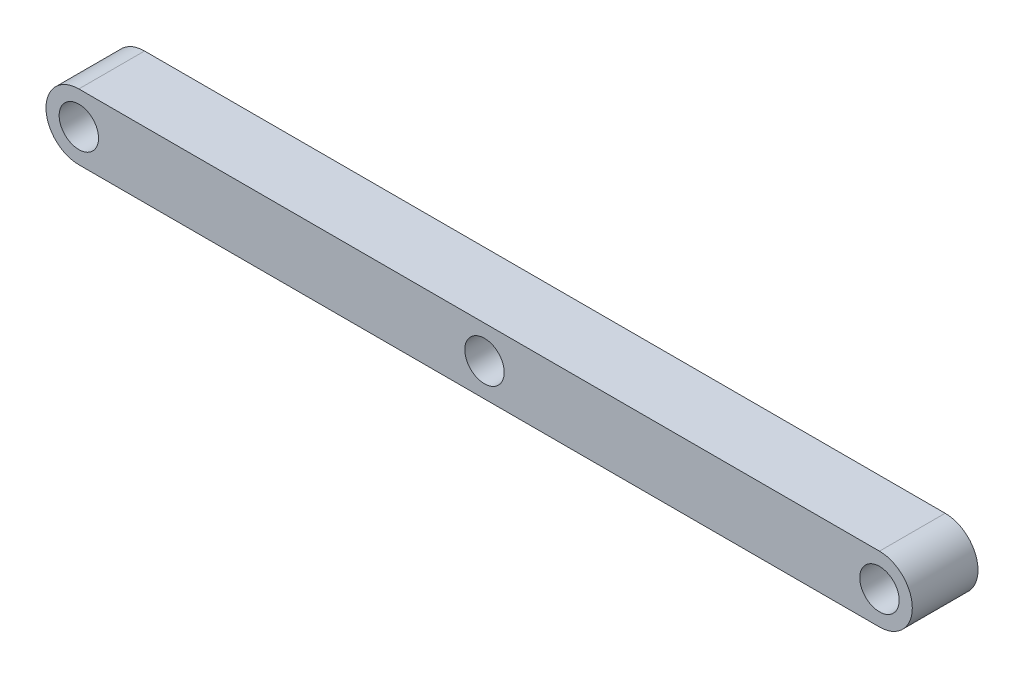
ISO-10303-21;
HEADER;
FILE_DESCRIPTION(('STEP AP214'),'2;1');
FILE_NAME('part.step','',(''),(''),'','','');
FILE_SCHEMA(('AUTOMOTIVE_DESIGN { 1 0 10303 214 1 1 1 1 }'));
ENDSEC;
DATA;
#1=APPLICATION_CONTEXT('core data for automotive mechanical design processes');
#2=APPLICATION_PROTOCOL_DEFINITION('international standard','automotive_design',2000,#1);
#3=PRODUCT_CONTEXT('',#1,'mechanical');
#4=PRODUCT('Part','Part','',(#3));
#5=PRODUCT_RELATED_PRODUCT_CATEGORY('part','',(#4));
#6=PRODUCT_DEFINITION_FORMATION('','',#4);
#7=PRODUCT_DEFINITION_CONTEXT('part definition',#1,'design');
#8=PRODUCT_DEFINITION('design','',#6,#7);
#9=PRODUCT_DEFINITION_SHAPE('','',#8);
#10=(LENGTH_UNIT() NAMED_UNIT(*) SI_UNIT(.MILLI.,.METRE.));
#11=(NAMED_UNIT(*) PLANE_ANGLE_UNIT() SI_UNIT($,.RADIAN.));
#12=(NAMED_UNIT(*) SI_UNIT($,.STERADIAN.) SOLID_ANGLE_UNIT());
#13=UNCERTAINTY_MEASURE_WITH_UNIT(LENGTH_MEASURE(1.E-05),#10,'distance_accuracy_value','');
#14=(GEOMETRIC_REPRESENTATION_CONTEXT(3) GLOBAL_UNCERTAINTY_ASSIGNED_CONTEXT((#13)) GLOBAL_UNIT_ASSIGNED_CONTEXT((#10,
#11,#12)) REPRESENTATION_CONTEXT('',''));
#15=CARTESIAN_POINT('',(0.,0.,0.));
#16=DIRECTION('',(0.,0.,1.));
#17=DIRECTION('',(1.,0.,0.));
#18=AXIS2_PLACEMENT_3D('',#15,#16,#17);
#19=CARTESIAN_POINT('',(-30.46875,0.,2.5));
#20=DIRECTION('',(0.,0.,1.));
#21=DIRECTION('',(1.,0.,0.));
#22=AXIS2_PLACEMENT_3D('',#19,#20,#21);
#23=PLANE('',#22);
#24=CARTESIAN_POINT('',(30.46875,0.,2.5));
#25=DIRECTION('',(0.,0.,1.));
#26=DIRECTION('',(1.,0.,0.));
#27=AXIS2_PLACEMENT_3D('',#24,#25,#26);
#28=CIRCLE('',#27,1.5);
#29=CARTESIAN_POINT('',(31.96875,0.,2.5));
#30=VERTEX_POINT('',#29);
#31=EDGE_CURVE('E117',#30,#30,#28,.T.);
#32=ORIENTED_EDGE('',*,*,#31,.F.);
#33=EDGE_LOOP('',(#32));
#34=FACE_BOUND('',#33,.T.);
#35=CARTESIAN_POINT('',(-30.46875,0.,2.5));
#36=DIRECTION('',(0.,0.,1.));
#37=DIRECTION('',(1.,0.,0.));
#38=AXIS2_PLACEMENT_3D('',#35,#36,#37);
#39=CIRCLE('',#38,2.5);
#40=CARTESIAN_POINT('',(-30.46875,2.5,2.5));
#41=VERTEX_POINT('',#40);
#42=CARTESIAN_POINT('',(-30.46875,-2.5,2.5));
#43=VERTEX_POINT('',#42);
#44=EDGE_CURVE('E87',#41,#43,#39,.T.);
#45=ORIENTED_EDGE('',*,*,#44,.T.);
#46=DIRECTION('',(1.,0.,0.));
#47=VECTOR('',#46,1.);
#48=CARTESIAN_POINT('',(-30.46875,-2.5,2.5));
#49=LINE('',#48,#47);
#50=CARTESIAN_POINT('',(30.46875,-2.49999999999999,2.5));
#51=VERTEX_POINT('',#50);
#52=EDGE_CURVE('E82',#43,#51,#49,.T.);
#53=ORIENTED_EDGE('',*,*,#52,.T.);
#54=CARTESIAN_POINT('',(30.46875,0.,2.5));
#55=DIRECTION('',(0.,0.,1.));
#56=DIRECTION('',(1.,0.,0.));
#57=AXIS2_PLACEMENT_3D('',#54,#55,#56);
#58=CIRCLE('',#57,2.5);
#59=CARTESIAN_POINT('',(30.46875,2.50000000000001,2.5));
#60=VERTEX_POINT('',#59);
#61=EDGE_CURVE('E85',#51,#60,#58,.T.);
#62=ORIENTED_EDGE('',*,*,#61,.T.);
#63=DIRECTION('',(-1.,0.,0.));
#64=VECTOR('',#63,1.);
#65=CARTESIAN_POINT('',(-30.46875,2.5,2.5));
#66=LINE('',#65,#64);
#67=EDGE_CURVE('E52',#60,#41,#66,.T.);
#68=ORIENTED_EDGE('',*,*,#67,.T.);
#69=EDGE_LOOP('',(#45,#53,#62,#68));
#70=FACE_BOUND('',#69,.T.);
#71=CARTESIAN_POINT('',(-30.46875,0.,2.5));
#72=DIRECTION('',(0.,0.,1.));
#73=DIRECTION('',(1.,0.,0.));
#74=AXIS2_PLACEMENT_3D('',#71,#72,#73);
#75=CIRCLE('',#74,1.5);
#76=CARTESIAN_POINT('',(-28.96875,0.,2.5));
#77=VERTEX_POINT('',#76);
#78=EDGE_CURVE('E102',#77,#77,#75,.T.);
#79=ORIENTED_EDGE('',*,*,#78,.F.);
#80=EDGE_LOOP('',(#79));
#81=FACE_BOUND('',#80,.T.);
#82=CARTESIAN_POINT('',(0.40625,0.,2.5));
#83=DIRECTION('',(0.,0.,1.));
#84=DIRECTION('',(1.,0.,0.));
#85=AXIS2_PLACEMENT_3D('',#82,#83,#84);
#86=CIRCLE('',#85,1.5);
#87=CARTESIAN_POINT('',(1.90625,0.,2.5));
#88=VERTEX_POINT('',#87);
#89=EDGE_CURVE('E123',#88,#88,#86,.T.);
#90=ORIENTED_EDGE('',*,*,#89,.F.);
#91=EDGE_LOOP('',(#90));
#92=FACE_BOUND('',#91,.T.);
#93=ADVANCED_FACE('F35',(#34,#70,#81,#92),#23,.T.);
#94=CARTESIAN_POINT('',(-30.46875,0.,-2.5));
#95=DIRECTION('',(0.,0.,1.));
#96=DIRECTION('',(1.,0.,0.));
#97=AXIS2_PLACEMENT_3D('',#94,#95,#96);
#98=PLANE('',#97);
#99=CARTESIAN_POINT('',(-30.46875,0.,-2.5));
#100=DIRECTION('',(0.,0.,1.));
#101=DIRECTION('',(1.,0.,0.));
#102=AXIS2_PLACEMENT_3D('',#99,#100,#101);
#103=CIRCLE('',#102,2.5);
#104=CARTESIAN_POINT('',(-30.46875,2.5,-2.5));
#105=VERTEX_POINT('',#104);
#106=CARTESIAN_POINT('',(-30.46875,-2.5,-2.5));
#107=VERTEX_POINT('',#106);
#108=EDGE_CURVE('E99',#105,#107,#103,.T.);
#109=ORIENTED_EDGE('',*,*,#108,.F.);
#110=DIRECTION('',(-1.,0.,0.));
#111=VECTOR('',#110,1.);
#112=CARTESIAN_POINT('',(-30.46875,2.5,-2.5));
#113=LINE('',#112,#111);
#114=CARTESIAN_POINT('',(30.46875,2.50000000000001,-2.5));
#115=VERTEX_POINT('',#114);
#116=EDGE_CURVE('E75',#115,#105,#113,.T.);
#117=ORIENTED_EDGE('',*,*,#116,.F.);
#118=CARTESIAN_POINT('',(30.46875,0.,-2.5));
#119=DIRECTION('',(0.,0.,1.));
#120=DIRECTION('',(1.,0.,0.));
#121=AXIS2_PLACEMENT_3D('',#118,#119,#120);
#122=CIRCLE('',#121,2.5);
#123=CARTESIAN_POINT('',(30.46875,-2.49999999999999,-2.5));
#124=VERTEX_POINT('',#123);
#125=EDGE_CURVE('E69',#124,#115,#122,.T.);
#126=ORIENTED_EDGE('',*,*,#125,.F.);
#127=DIRECTION('',(1.,0.,0.));
#128=VECTOR('',#127,1.);
#129=CARTESIAN_POINT('',(-30.46875,-2.5,-2.5));
#130=LINE('',#129,#128);
#131=EDGE_CURVE('E91',#107,#124,#130,.T.);
#132=ORIENTED_EDGE('',*,*,#131,.F.);
#133=EDGE_LOOP('',(#109,#117,#126,#132));
#134=FACE_BOUND('',#133,.T.);
#135=CARTESIAN_POINT('',(-30.46875,0.,-2.5));
#136=DIRECTION('',(0.,0.,1.));
#137=DIRECTION('',(1.,0.,0.));
#138=AXIS2_PLACEMENT_3D('',#135,#136,#137);
#139=CIRCLE('',#138,1.5);
#140=CARTESIAN_POINT('',(-28.96875,0.,-2.5));
#141=VERTEX_POINT('',#140);
#142=EDGE_CURVE('E114',#141,#141,#139,.T.);
#143=ORIENTED_EDGE('',*,*,#142,.T.);
#144=EDGE_LOOP('',(#143));
#145=FACE_BOUND('',#144,.T.);
#146=CARTESIAN_POINT('',(30.46875,0.,-2.5));
#147=DIRECTION('',(0.,0.,1.));
#148=DIRECTION('',(1.,0.,0.));
#149=AXIS2_PLACEMENT_3D('',#146,#147,#148);
#150=CIRCLE('',#149,1.5);
#151=CARTESIAN_POINT('',(31.96875,0.,-2.5));
#152=VERTEX_POINT('',#151);
#153=EDGE_CURVE('E120',#152,#152,#150,.T.);
#154=ORIENTED_EDGE('',*,*,#153,.T.);
#155=EDGE_LOOP('',(#154));
#156=FACE_BOUND('',#155,.T.);
#157=CARTESIAN_POINT('',(0.40625,0.,-2.5));
#158=DIRECTION('',(0.,0.,1.));
#159=DIRECTION('',(1.,0.,0.));
#160=AXIS2_PLACEMENT_3D('',#157,#158,#159);
#161=CIRCLE('',#160,1.5);
#162=CARTESIAN_POINT('',(1.90625,0.,-2.5));
#163=VERTEX_POINT('',#162);
#164=EDGE_CURVE('E126',#163,#163,#161,.T.);
#165=ORIENTED_EDGE('',*,*,#164,.T.);
#166=EDGE_LOOP('',(#165));
#167=FACE_BOUND('',#166,.T.);
#168=ADVANCED_FACE('F110',(#134,#145,#156,#167),#98,.F.);
#169=CARTESIAN_POINT('',(-30.46875,0.,2.5));
#170=DIRECTION('',(0.,0.,-1.));
#171=DIRECTION('',(-1.,0.,0.));
#172=AXIS2_PLACEMENT_3D('',#169,#170,#171);
#173=CYLINDRICAL_SURFACE('',#172,2.5);
#174=ORIENTED_EDGE('',*,*,#108,.T.);
#175=DIRECTION('',(0.,0.,-1.));
#176=VECTOR('',#175,1.);
#177=CARTESIAN_POINT('',(-30.46875,-2.5,2.5));
#178=LINE('',#177,#176);
#179=EDGE_CURVE('E11',#43,#107,#178,.T.);
#180=ORIENTED_EDGE('',*,*,#179,.F.);
#181=ORIENTED_EDGE('',*,*,#44,.F.);
#182=DIRECTION('',(0.,0.,-1.));
#183=VECTOR('',#182,1.);
#184=CARTESIAN_POINT('',(-30.46875,2.5,2.5));
#185=LINE('',#184,#183);
#186=EDGE_CURVE('E95',#41,#105,#185,.T.);
#187=ORIENTED_EDGE('',*,*,#186,.T.);
#188=EDGE_LOOP('',(#174,#180,#181,#187));
#189=FACE_BOUND('',#188,.T.);
#190=ADVANCED_FACE('F37',(#189),#173,.T.);
#191=CARTESIAN_POINT('',(-30.46875,-2.5,2.5));
#192=DIRECTION('',(0.,1.,0.));
#193=DIRECTION('',(-1.,0.,0.));
#194=AXIS2_PLACEMENT_3D('',#191,#192,#193);
#195=PLANE('',#194);
#196=ORIENTED_EDGE('',*,*,#131,.T.);
#197=DIRECTION('',(0.,0.,-1.));
#198=VECTOR('',#197,1.);
#199=CARTESIAN_POINT('',(30.46875,-2.49999999999999,2.5));
#200=LINE('',#199,#198);
#201=EDGE_CURVE('E44',#51,#124,#200,.T.);
#202=ORIENTED_EDGE('',*,*,#201,.F.);
#203=ORIENTED_EDGE('',*,*,#52,.F.);
#204=ORIENTED_EDGE('',*,*,#179,.T.);
#205=EDGE_LOOP('',(#196,#202,#203,#204));
#206=FACE_BOUND('',#205,.T.);
#207=ADVANCED_FACE('F90',(#206),#195,.F.);
#208=CARTESIAN_POINT('',(30.46875,0.,2.5));
#209=DIRECTION('',(0.,0.,-1.));
#210=DIRECTION('',(-1.,0.,0.));
#211=AXIS2_PLACEMENT_3D('',#208,#209,#210);
#212=CYLINDRICAL_SURFACE('',#211,2.5);
#213=ORIENTED_EDGE('',*,*,#125,.T.);
#214=DIRECTION('',(0.,0.,-1.));
#215=VECTOR('',#214,1.);
#216=CARTESIAN_POINT('',(30.46875,2.50000000000001,2.5));
#217=LINE('',#216,#215);
#218=EDGE_CURVE('E92',#60,#115,#217,.T.);
#219=ORIENTED_EDGE('',*,*,#218,.F.);
#220=ORIENTED_EDGE('',*,*,#61,.F.);
#221=ORIENTED_EDGE('',*,*,#201,.T.);
#222=EDGE_LOOP('',(#213,#219,#220,#221));
#223=FACE_BOUND('',#222,.T.);
#224=ADVANCED_FACE('F93',(#223),#212,.T.);
#225=CARTESIAN_POINT('',(-30.46875,2.5,2.5));
#226=DIRECTION('',(0.,-1.,0.));
#227=DIRECTION('',(1.,0.,0.));
#228=AXIS2_PLACEMENT_3D('',#225,#226,#227);
#229=PLANE('',#228);
#230=ORIENTED_EDGE('',*,*,#116,.T.);
#231=ORIENTED_EDGE('',*,*,#186,.F.);
#232=ORIENTED_EDGE('',*,*,#67,.F.);
#233=ORIENTED_EDGE('',*,*,#218,.T.);
#234=EDGE_LOOP('',(#230,#231,#232,#233));
#235=FACE_BOUND('',#234,.T.);
#236=ADVANCED_FACE('F107',(#235),#229,.F.);
#237=CARTESIAN_POINT('',(-30.46875,0.,2.5));
#238=DIRECTION('',(0.,0.,-1.));
#239=DIRECTION('',(-1.,0.,0.));
#240=AXIS2_PLACEMENT_3D('',#237,#238,#239);
#241=CYLINDRICAL_SURFACE('',#240,1.5);
#242=ORIENTED_EDGE('',*,*,#78,.T.);
#243=EDGE_LOOP('',(#242));
#244=FACE_BOUND('',#243,.T.);
#245=ORIENTED_EDGE('',*,*,#142,.F.);
#246=EDGE_LOOP('',(#245));
#247=FACE_BOUND('',#246,.T.);
#248=ADVANCED_FACE('F144',(#244,#247),#241,.F.);
#249=CARTESIAN_POINT('',(30.46875,0.,2.5));
#250=DIRECTION('',(0.,0.,-1.));
#251=DIRECTION('',(-1.,0.,0.));
#252=AXIS2_PLACEMENT_3D('',#249,#250,#251);
#253=CYLINDRICAL_SURFACE('',#252,1.5);
#254=ORIENTED_EDGE('',*,*,#31,.T.);
#255=EDGE_LOOP('',(#254));
#256=FACE_BOUND('',#255,.T.);
#257=ORIENTED_EDGE('',*,*,#153,.F.);
#258=EDGE_LOOP('',(#257));
#259=FACE_BOUND('',#258,.T.);
#260=ADVANCED_FACE('F190',(#256,#259),#253,.F.);
#261=CARTESIAN_POINT('',(0.40625,0.,2.5));
#262=DIRECTION('',(0.,0.,-1.));
#263=DIRECTION('',(-1.,0.,0.));
#264=AXIS2_PLACEMENT_3D('',#261,#262,#263);
#265=CYLINDRICAL_SURFACE('',#264,1.5);
#266=ORIENTED_EDGE('',*,*,#89,.T.);
#267=EDGE_LOOP('',(#266));
#268=FACE_BOUND('',#267,.T.);
#269=ORIENTED_EDGE('',*,*,#164,.F.);
#270=EDGE_LOOP('',(#269));
#271=FACE_BOUND('',#270,.T.);
#272=ADVANCED_FACE('F132',(#268,#271),#265,.F.);
#273=CLOSED_SHELL('',(#93,#168,#190,#207,#224,#236,#248,#260,#272));
#274=MANIFOLD_SOLID_BREP('B2',#273);
#275=ADVANCED_BREP_SHAPE_REPRESENTATION('',(#18,#274),#14);
#276=SHAPE_DEFINITION_REPRESENTATION(#9,#275);
ENDSEC;
END-ISO-10303-21;
